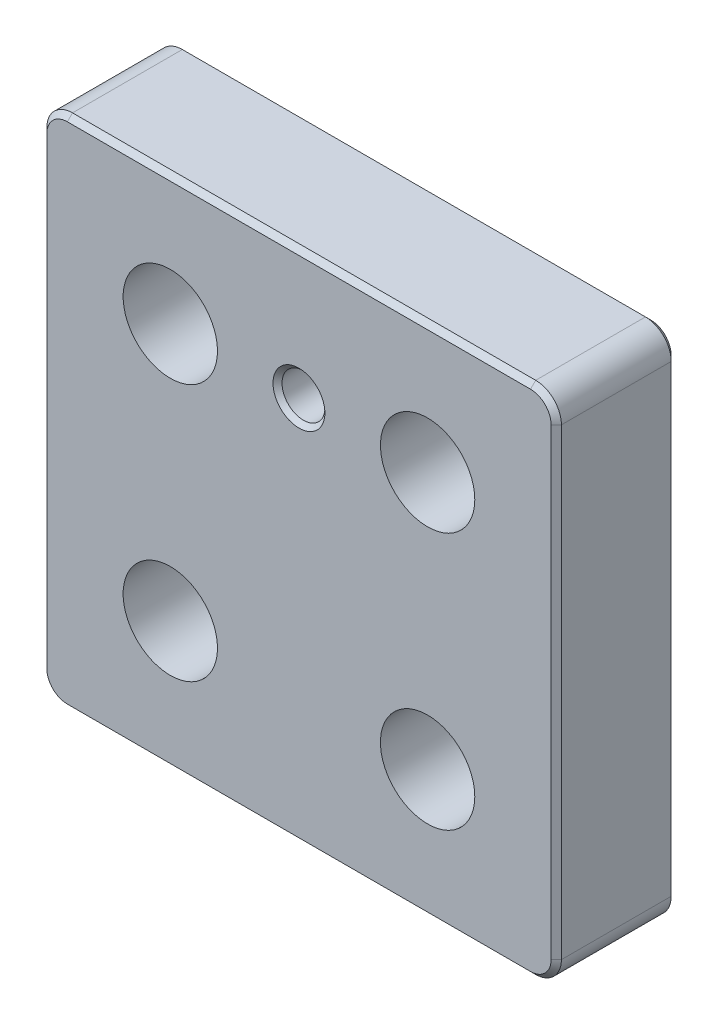
ISO-10303-21;
HEADER;
FILE_DESCRIPTION(('STEP AP214'),'2;1');
FILE_NAME('part.step','',(''),(''),'','','');
FILE_SCHEMA(('AUTOMOTIVE_DESIGN { 1 0 10303 214 1 1 1 1 }'));
ENDSEC;
DATA;
#1=APPLICATION_CONTEXT('core data for automotive mechanical design processes');
#2=APPLICATION_PROTOCOL_DEFINITION('international standard','automotive_design',2000,#1);
#3=PRODUCT_CONTEXT('',#1,'mechanical');
#4=PRODUCT('Part','Part','',(#3));
#5=PRODUCT_RELATED_PRODUCT_CATEGORY('part','',(#4));
#6=PRODUCT_DEFINITION_FORMATION('','',#4);
#7=PRODUCT_DEFINITION_CONTEXT('part definition',#1,'design');
#8=PRODUCT_DEFINITION('design','',#6,#7);
#9=PRODUCT_DEFINITION_SHAPE('','',#8);
#10=(LENGTH_UNIT() NAMED_UNIT(*) SI_UNIT(.MILLI.,.METRE.));
#11=(NAMED_UNIT(*) PLANE_ANGLE_UNIT() SI_UNIT($,.RADIAN.));
#12=(NAMED_UNIT(*) SI_UNIT($,.STERADIAN.) SOLID_ANGLE_UNIT());
#13=UNCERTAINTY_MEASURE_WITH_UNIT(LENGTH_MEASURE(1.E-05),#10,'distance_accuracy_value','');
#14=(GEOMETRIC_REPRESENTATION_CONTEXT(3) GLOBAL_UNCERTAINTY_ASSIGNED_CONTEXT((#13)) GLOBAL_UNIT_ASSIGNED_CONTEXT((#10,
#11,#12)) REPRESENTATION_CONTEXT('',''));
#15=CARTESIAN_POINT('',(0.,0.,0.));
#16=DIRECTION('',(0.,0.,1.));
#17=DIRECTION('',(1.,0.,0.));
#18=AXIS2_PLACEMENT_3D('',#15,#16,#17);
#19=CARTESIAN_POINT('',(-30.,-30.,14.));
#20=DIRECTION('',(1.,0.,0.));
#21=DIRECTION('',(0.,0.,-1.));
#22=AXIS2_PLACEMENT_3D('',#19,#20,#21);
#23=PLANE('',#22);
#24=DIRECTION('',(0.,0.,-1.));
#25=VECTOR('',#24,1.);
#26=CARTESIAN_POINT('',(-30.,27.,14.));
#27=LINE('',#26,#25);
#28=CARTESIAN_POINT('',(-30.,27.,13.4));
#29=VERTEX_POINT('',#28);
#30=CARTESIAN_POINT('',(-30.,27.,0.599999999999996));
#31=VERTEX_POINT('',#30);
#32=EDGE_CURVE('E295',#29,#31,#27,.T.);
#33=ORIENTED_EDGE('',*,*,#32,.T.);
#34=DIRECTION('',(0.,-1.,0.));
#35=VECTOR('',#34,1.);
#36=CARTESIAN_POINT('',(-30.,-30.,0.599999999999996));
#37=LINE('',#36,#35);
#38=CARTESIAN_POINT('',(-30.,-27.,0.599999999999996));
#39=VERTEX_POINT('',#38);
#40=EDGE_CURVE('E221',#31,#39,#37,.T.);
#41=ORIENTED_EDGE('',*,*,#40,.T.);
#42=DIRECTION('',(0.,0.,-1.));
#43=VECTOR('',#42,1.);
#44=CARTESIAN_POINT('',(-30.,-27.,14.));
#45=LINE('',#44,#43);
#46=CARTESIAN_POINT('',(-30.,-27.,13.4));
#47=VERTEX_POINT('',#46);
#48=EDGE_CURVE('E289',#39,#47,#45,.F.);
#49=ORIENTED_EDGE('',*,*,#48,.T.);
#50=DIRECTION('',(0.,1.,0.));
#51=VECTOR('',#50,1.);
#52=CARTESIAN_POINT('',(-30.,27.,13.4));
#53=LINE('',#52,#51);
#54=EDGE_CURVE('E219',#47,#29,#53,.T.);
#55=ORIENTED_EDGE('',*,*,#54,.T.);
#56=EDGE_LOOP('',(#33,#41,#49,#55));
#57=FACE_BOUND('',#56,.T.);
#58=ADVANCED_FACE('F45',(#57),#23,.F.);
#59=CARTESIAN_POINT('',(30.,-30.,14.));
#60=DIRECTION('',(0.,1.,0.));
#61=DIRECTION('',(-1.,0.,0.));
#62=AXIS2_PLACEMENT_3D('',#59,#60,#61);
#63=PLANE('',#62);
#64=DIRECTION('',(0.,0.,-1.));
#65=VECTOR('',#64,1.);
#66=CARTESIAN_POINT('',(-27.,-30.,14.));
#67=LINE('',#66,#65);
#68=CARTESIAN_POINT('',(-27.,-30.,13.4));
#69=VERTEX_POINT('',#68);
#70=CARTESIAN_POINT('',(-27.,-30.,0.599999999999996));
#71=VERTEX_POINT('',#70);
#72=EDGE_CURVE('E291',#69,#71,#67,.T.);
#73=ORIENTED_EDGE('',*,*,#72,.T.);
#74=DIRECTION('',(1.,0.,0.));
#75=VECTOR('',#74,1.);
#76=CARTESIAN_POINT('',(30.,-30.,0.599999999999996));
#77=LINE('',#76,#75);
#78=CARTESIAN_POINT('',(27.,-30.,0.599999999999996));
#79=VERTEX_POINT('',#78);
#80=EDGE_CURVE('E196',#71,#79,#77,.T.);
#81=ORIENTED_EDGE('',*,*,#80,.T.);
#82=DIRECTION('',(0.,0.,-1.));
#83=VECTOR('',#82,1.);
#84=CARTESIAN_POINT('',(27.,-30.,14.));
#85=LINE('',#84,#83);
#86=CARTESIAN_POINT('',(27.,-30.,13.4));
#87=VERTEX_POINT('',#86);
#88=EDGE_CURVE('E179',#79,#87,#85,.F.);
#89=ORIENTED_EDGE('',*,*,#88,.T.);
#90=DIRECTION('',(-1.,0.,0.));
#91=VECTOR('',#90,1.);
#92=CARTESIAN_POINT('',(-27.,-30.,13.4));
#93=LINE('',#92,#91);
#94=EDGE_CURVE('E194',#87,#69,#93,.T.);
#95=ORIENTED_EDGE('',*,*,#94,.T.);
#96=EDGE_LOOP('',(#73,#81,#89,#95));
#97=FACE_BOUND('',#96,.T.);
#98=ADVANCED_FACE('F337',(#97),#63,.F.);
#99=CARTESIAN_POINT('',(30.,-30.,14.));
#100=DIRECTION('',(-1.,0.,0.));
#101=DIRECTION('',(0.,0.,1.));
#102=AXIS2_PLACEMENT_3D('',#99,#100,#101);
#103=PLANE('',#102);
#104=DIRECTION('',(0.,0.,-1.));
#105=VECTOR('',#104,1.);
#106=CARTESIAN_POINT('',(30.,-27.,14.));
#107=LINE('',#106,#105);
#108=CARTESIAN_POINT('',(30.,-27.,13.4));
#109=VERTEX_POINT('',#108);
#110=CARTESIAN_POINT('',(30.,-27.,0.599999999999996));
#111=VERTEX_POINT('',#110);
#112=EDGE_CURVE('E310',#109,#111,#107,.T.);
#113=ORIENTED_EDGE('',*,*,#112,.T.);
#114=DIRECTION('',(0.,1.,0.));
#115=VECTOR('',#114,1.);
#116=CARTESIAN_POINT('',(30.,-30.,0.599999999999996));
#117=LINE('',#116,#115);
#118=CARTESIAN_POINT('',(30.,27.,0.599999999999996));
#119=VERTEX_POINT('',#118);
#120=EDGE_CURVE('E204',#111,#119,#117,.T.);
#121=ORIENTED_EDGE('',*,*,#120,.T.);
#122=DIRECTION('',(0.,0.,-1.));
#123=VECTOR('',#122,1.);
#124=CARTESIAN_POINT('',(30.,27.,14.));
#125=LINE('',#124,#123);
#126=CARTESIAN_POINT('',(30.,27.,13.4));
#127=VERTEX_POINT('',#126);
#128=EDGE_CURVE('E313',#119,#127,#125,.F.);
#129=ORIENTED_EDGE('',*,*,#128,.T.);
#130=DIRECTION('',(0.,-1.,0.));
#131=VECTOR('',#130,1.);
#132=CARTESIAN_POINT('',(30.,-27.,13.4));
#133=LINE('',#132,#131);
#134=EDGE_CURVE('E202',#127,#109,#133,.T.);
#135=ORIENTED_EDGE('',*,*,#134,.T.);
#136=EDGE_LOOP('',(#113,#121,#129,#135));
#137=FACE_BOUND('',#136,.T.);
#138=ADVANCED_FACE('F382',(#137),#103,.F.);
#139=CARTESIAN_POINT('',(30.,30.,14.));
#140=DIRECTION('',(0.,-1.,0.));
#141=DIRECTION('',(1.,0.,0.));
#142=AXIS2_PLACEMENT_3D('',#139,#140,#141);
#143=PLANE('',#142);
#144=DIRECTION('',(0.,0.,-1.));
#145=VECTOR('',#144,1.);
#146=CARTESIAN_POINT('',(27.,30.,14.));
#147=LINE('',#146,#145);
#148=CARTESIAN_POINT('',(27.,30.,13.4));
#149=VERTEX_POINT('',#148);
#150=CARTESIAN_POINT('',(27.,30.,0.599999999999996));
#151=VERTEX_POINT('',#150);
#152=EDGE_CURVE('E298',#149,#151,#147,.T.);
#153=ORIENTED_EDGE('',*,*,#152,.T.);
#154=DIRECTION('',(-1.,0.,0.));
#155=VECTOR('',#154,1.);
#156=CARTESIAN_POINT('',(30.,30.,0.599999999999996));
#157=LINE('',#156,#155);
#158=CARTESIAN_POINT('',(-27.,30.,0.599999999999996));
#159=VERTEX_POINT('',#158);
#160=EDGE_CURVE('E213',#151,#159,#157,.T.);
#161=ORIENTED_EDGE('',*,*,#160,.T.);
#162=DIRECTION('',(0.,0.,-1.));
#163=VECTOR('',#162,1.);
#164=CARTESIAN_POINT('',(-27.,30.,14.));
#165=LINE('',#164,#163);
#166=CARTESIAN_POINT('',(-27.,30.,13.4));
#167=VERTEX_POINT('',#166);
#168=EDGE_CURVE('E307',#159,#167,#165,.F.);
#169=ORIENTED_EDGE('',*,*,#168,.T.);
#170=DIRECTION('',(1.,0.,0.));
#171=VECTOR('',#170,1.);
#172=CARTESIAN_POINT('',(27.,30.,13.4));
#173=LINE('',#172,#171);
#174=EDGE_CURVE('E211',#167,#149,#173,.T.);
#175=ORIENTED_EDGE('',*,*,#174,.T.);
#176=EDGE_LOOP('',(#153,#161,#169,#175));
#177=FACE_BOUND('',#176,.T.);
#178=ADVANCED_FACE('F366',(#177),#143,.F.);
#179=CARTESIAN_POINT('',(0.,0.,14.));
#180=DIRECTION('',(0.,0.,1.));
#181=DIRECTION('',(1.,0.,0.));
#182=AXIS2_PLACEMENT_3D('',#179,#180,#181);
#183=PLANE('',#182);
#184=DIRECTION('',(0.,1.,0.));
#185=VECTOR('',#184,1.);
#186=CARTESIAN_POINT('',(29.4,27.,14.));
#187=LINE('',#186,#185);
#188=CARTESIAN_POINT('',(29.4,-27.,14.));
#189=VERTEX_POINT('',#188);
#190=CARTESIAN_POINT('',(29.4,27.,14.));
#191=VERTEX_POINT('',#190);
#192=EDGE_CURVE('E55',#189,#191,#187,.T.);
#193=ORIENTED_EDGE('',*,*,#192,.T.);
#194=CARTESIAN_POINT('',(27.,27.,14.));
#195=DIRECTION('',(0.,0.,1.));
#196=DIRECTION('',(1.,0.,0.));
#197=AXIS2_PLACEMENT_3D('',#194,#195,#196);
#198=CIRCLE('',#197,2.40000000000001);
#199=CARTESIAN_POINT('',(27.,29.4,14.));
#200=VERTEX_POINT('',#199);
#201=EDGE_CURVE('E11',#191,#200,#198,.T.);
#202=ORIENTED_EDGE('',*,*,#201,.T.);
#203=DIRECTION('',(-1.,0.,0.));
#204=VECTOR('',#203,1.);
#205=CARTESIAN_POINT('',(-27.,29.4,14.));
#206=LINE('',#205,#204);
#207=CARTESIAN_POINT('',(-27.,29.4,14.));
#208=VERTEX_POINT('',#207);
#209=EDGE_CURVE('E223',#200,#208,#206,.T.);
#210=ORIENTED_EDGE('',*,*,#209,.T.);
#211=CARTESIAN_POINT('',(-27.,27.,14.));
#212=DIRECTION('',(0.,0.,1.));
#213=DIRECTION('',(1.,0.,0.));
#214=AXIS2_PLACEMENT_3D('',#211,#212,#213);
#215=CIRCLE('',#214,2.40000000000001);
#216=CARTESIAN_POINT('',(-29.4,27.,14.));
#217=VERTEX_POINT('',#216);
#218=EDGE_CURVE('E225',#208,#217,#215,.T.);
#219=ORIENTED_EDGE('',*,*,#218,.T.);
#220=DIRECTION('',(0.,-1.,0.));
#221=VECTOR('',#220,1.);
#222=CARTESIAN_POINT('',(-29.4,-27.,14.));
#223=LINE('',#222,#221);
#224=CARTESIAN_POINT('',(-29.4,-27.,14.));
#225=VERTEX_POINT('',#224);
#226=EDGE_CURVE('E227',#217,#225,#223,.T.);
#227=ORIENTED_EDGE('',*,*,#226,.T.);
#228=CARTESIAN_POINT('',(-27.,-27.,14.));
#229=DIRECTION('',(0.,0.,1.));
#230=DIRECTION('',(1.,0.,0.));
#231=AXIS2_PLACEMENT_3D('',#228,#229,#230);
#232=CIRCLE('',#231,2.40000000000001);
#233=CARTESIAN_POINT('',(-27.,-29.4,14.));
#234=VERTEX_POINT('',#233);
#235=EDGE_CURVE('E229',#225,#234,#232,.T.);
#236=ORIENTED_EDGE('',*,*,#235,.T.);
#237=DIRECTION('',(1.,0.,0.));
#238=VECTOR('',#237,1.);
#239=CARTESIAN_POINT('',(27.,-29.4,14.));
#240=LINE('',#239,#238);
#241=CARTESIAN_POINT('',(27.,-29.4,14.));
#242=VERTEX_POINT('',#241);
#243=EDGE_CURVE('E231',#234,#242,#240,.T.);
#244=ORIENTED_EDGE('',*,*,#243,.T.);
#245=CARTESIAN_POINT('',(27.,-27.,14.));
#246=DIRECTION('',(0.,0.,1.));
#247=DIRECTION('',(1.,0.,0.));
#248=AXIS2_PLACEMENT_3D('',#245,#246,#247);
#249=CIRCLE('',#248,2.40000000000001);
#250=EDGE_CURVE('E66',#242,#189,#249,.T.);
#251=ORIENTED_EDGE('',*,*,#250,.T.);
#252=EDGE_LOOP('',(#193,#202,#210,#219,#227,#236,#244,#251));
#253=FACE_BOUND('',#252,.T.);
#254=CARTESIAN_POINT('',(0.,15.,14.));
#255=DIRECTION('',(0.,0.,1.));
#256=DIRECTION('',(1.,0.,0.));
#257=AXIS2_PLACEMENT_3D('',#254,#255,#256);
#258=CIRCLE('',#257,3.025);
#259=CARTESIAN_POINT('',(3.025,15.,14.));
#260=VERTEX_POINT('',#259);
#261=EDGE_CURVE('E252',#260,#260,#258,.T.);
#262=ORIENTED_EDGE('',*,*,#261,.F.);
#263=EDGE_LOOP('',(#262));
#264=FACE_BOUND('',#263,.T.);
#265=CARTESIAN_POINT('',(-15.,15.,14.));
#266=DIRECTION('',(0.,0.,1.));
#267=DIRECTION('',(1.,0.,0.));
#268=AXIS2_PLACEMENT_3D('',#265,#266,#267);
#269=CIRCLE('',#268,5.49999999999999);
#270=CARTESIAN_POINT('',(-9.50000000000001,15.,14.));
#271=VERTEX_POINT('',#270);
#272=EDGE_CURVE('E913',#271,#271,#269,.T.);
#273=ORIENTED_EDGE('',*,*,#272,.F.);
#274=EDGE_LOOP('',(#273));
#275=FACE_BOUND('',#274,.T.);
#276=CARTESIAN_POINT('',(15.,15.,14.));
#277=DIRECTION('',(0.,0.,1.));
#278=DIRECTION('',(1.,0.,0.));
#279=AXIS2_PLACEMENT_3D('',#276,#277,#278);
#280=CIRCLE('',#279,5.49999999999999);
#281=CARTESIAN_POINT('',(20.5,15.,14.));
#282=VERTEX_POINT('',#281);
#283=EDGE_CURVE('E901',#282,#282,#280,.T.);
#284=ORIENTED_EDGE('',*,*,#283,.F.);
#285=EDGE_LOOP('',(#284));
#286=FACE_BOUND('',#285,.T.);
#287=CARTESIAN_POINT('',(15.,-15.,14.));
#288=DIRECTION('',(0.,0.,1.));
#289=DIRECTION('',(1.,0.,0.));
#290=AXIS2_PLACEMENT_3D('',#287,#288,#289);
#291=CIRCLE('',#290,5.49999999999999);
#292=CARTESIAN_POINT('',(20.5,-15.,14.));
#293=VERTEX_POINT('',#292);
#294=EDGE_CURVE('E889',#293,#293,#291,.T.);
#295=ORIENTED_EDGE('',*,*,#294,.F.);
#296=EDGE_LOOP('',(#295));
#297=FACE_BOUND('',#296,.T.);
#298=CARTESIAN_POINT('',(-15.,-15.,14.));
#299=DIRECTION('',(0.,0.,1.));
#300=DIRECTION('',(1.,0.,0.));
#301=AXIS2_PLACEMENT_3D('',#298,#299,#300);
#302=CIRCLE('',#301,5.49999999999999);
#303=CARTESIAN_POINT('',(-9.5,-15.,14.));
#304=VERTEX_POINT('',#303);
#305=EDGE_CURVE('E875',#304,#304,#302,.T.);
#306=ORIENTED_EDGE('',*,*,#305,.F.);
#307=EDGE_LOOP('',(#306));
#308=FACE_BOUND('',#307,.T.);
#309=ADVANCED_FACE('F353',(#253,#264,#275,#286,#297,#308),#183,.T.);
#310=CARTESIAN_POINT('',(0.,0.,0.));
#311=DIRECTION('',(0.,0.,1.));
#312=DIRECTION('',(1.,0.,0.));
#313=AXIS2_PLACEMENT_3D('',#310,#311,#312);
#314=PLANE('',#313);
#315=DIRECTION('',(-1.,0.,0.));
#316=VECTOR('',#315,1.);
#317=CARTESIAN_POINT('',(0.,-29.4,0.));
#318=LINE('',#317,#316);
#319=CARTESIAN_POINT('',(27.,-29.4,0.));
#320=VERTEX_POINT('',#319);
#321=CARTESIAN_POINT('',(-27.,-29.4,0.));
#322=VERTEX_POINT('',#321);
#323=EDGE_CURVE('E184',#320,#322,#318,.T.);
#324=ORIENTED_EDGE('',*,*,#323,.T.);
#325=CARTESIAN_POINT('',(-27.,-27.,0.));
#326=DIRECTION('',(0.,0.,1.));
#327=DIRECTION('',(1.,0.,0.));
#328=AXIS2_PLACEMENT_3D('',#325,#326,#327);
#329=CIRCLE('',#328,2.4);
#330=CARTESIAN_POINT('',(-29.4,-27.,0.));
#331=VERTEX_POINT('',#330);
#332=EDGE_CURVE('E164',#322,#331,#329,.F.);
#333=ORIENTED_EDGE('',*,*,#332,.T.);
#334=DIRECTION('',(0.,1.,0.));
#335=VECTOR('',#334,1.);
#336=CARTESIAN_POINT('',(-29.4,0.,0.));
#337=LINE('',#336,#335);
#338=CARTESIAN_POINT('',(-29.4,27.,0.));
#339=VERTEX_POINT('',#338);
#340=EDGE_CURVE('E172',#331,#339,#337,.T.);
#341=ORIENTED_EDGE('',*,*,#340,.T.);
#342=CARTESIAN_POINT('',(-27.,27.,0.));
#343=DIRECTION('',(0.,0.,1.));
#344=DIRECTION('',(1.,0.,0.));
#345=AXIS2_PLACEMENT_3D('',#342,#343,#344);
#346=CIRCLE('',#345,2.4);
#347=CARTESIAN_POINT('',(-27.,29.4,0.));
#348=VERTEX_POINT('',#347);
#349=EDGE_CURVE('E178',#339,#348,#346,.F.);
#350=ORIENTED_EDGE('',*,*,#349,.T.);
#351=DIRECTION('',(1.,0.,0.));
#352=VECTOR('',#351,1.);
#353=CARTESIAN_POINT('',(0.,29.4,0.));
#354=LINE('',#353,#352);
#355=CARTESIAN_POINT('',(27.,29.4,0.));
#356=VERTEX_POINT('',#355);
#357=EDGE_CURVE('E320',#348,#356,#354,.T.);
#358=ORIENTED_EDGE('',*,*,#357,.T.);
#359=CARTESIAN_POINT('',(27.,27.,0.));
#360=DIRECTION('',(0.,0.,1.));
#361=DIRECTION('',(1.,0.,0.));
#362=AXIS2_PLACEMENT_3D('',#359,#360,#361);
#363=CIRCLE('',#362,2.4);
#364=CARTESIAN_POINT('',(29.4,27.,0.));
#365=VERTEX_POINT('',#364);
#366=EDGE_CURVE('E322',#356,#365,#363,.F.);
#367=ORIENTED_EDGE('',*,*,#366,.T.);
#368=DIRECTION('',(0.,-1.,0.));
#369=VECTOR('',#368,1.);
#370=CARTESIAN_POINT('',(29.4,0.,0.));
#371=LINE('',#370,#369);
#372=CARTESIAN_POINT('',(29.4,-27.,0.));
#373=VERTEX_POINT('',#372);
#374=EDGE_CURVE('E324',#365,#373,#371,.T.);
#375=ORIENTED_EDGE('',*,*,#374,.T.);
#376=CARTESIAN_POINT('',(27.,-27.,0.));
#377=DIRECTION('',(0.,0.,1.));
#378=DIRECTION('',(1.,0.,0.));
#379=AXIS2_PLACEMENT_3D('',#376,#377,#378);
#380=CIRCLE('',#379,2.4);
#381=EDGE_CURVE('E189',#373,#320,#380,.F.);
#382=ORIENTED_EDGE('',*,*,#381,.T.);
#383=EDGE_LOOP('',(#324,#333,#341,#350,#358,#367,#375,#382));
#384=FACE_BOUND('',#383,.T.);
#385=CARTESIAN_POINT('',(0.,15.,0.));
#386=DIRECTION('',(0.,0.,1.));
#387=DIRECTION('',(1.,0.,0.));
#388=AXIS2_PLACEMENT_3D('',#385,#386,#387);
#389=CIRCLE('',#388,2.5);
#390=CARTESIAN_POINT('',(2.49999999999999,15.,0.));
#391=VERTEX_POINT('',#390);
#392=EDGE_CURVE('E916',#391,#391,#389,.T.);
#393=ORIENTED_EDGE('',*,*,#392,.T.);
#394=EDGE_LOOP('',(#393));
#395=FACE_BOUND('',#394,.T.);
#396=CARTESIAN_POINT('',(-15.,15.,0.));
#397=DIRECTION('',(0.,0.,1.));
#398=DIRECTION('',(1.,0.,0.));
#399=AXIS2_PLACEMENT_3D('',#396,#397,#398);
#400=CIRCLE('',#399,3.25);
#401=CARTESIAN_POINT('',(-11.75,15.,0.));
#402=VERTEX_POINT('',#401);
#403=EDGE_CURVE('E904',#402,#402,#400,.T.);
#404=ORIENTED_EDGE('',*,*,#403,.T.);
#405=EDGE_LOOP('',(#404));
#406=FACE_BOUND('',#405,.T.);
#407=CARTESIAN_POINT('',(15.,15.,0.));
#408=DIRECTION('',(0.,0.,1.));
#409=DIRECTION('',(1.,0.,0.));
#410=AXIS2_PLACEMENT_3D('',#407,#408,#409);
#411=CIRCLE('',#410,3.25);
#412=CARTESIAN_POINT('',(18.25,15.,0.));
#413=VERTEX_POINT('',#412);
#414=EDGE_CURVE('E892',#413,#413,#411,.T.);
#415=ORIENTED_EDGE('',*,*,#414,.T.);
#416=EDGE_LOOP('',(#415));
#417=FACE_BOUND('',#416,.T.);
#418=CARTESIAN_POINT('',(15.,-15.,0.));
#419=DIRECTION('',(0.,0.,1.));
#420=DIRECTION('',(1.,0.,0.));
#421=AXIS2_PLACEMENT_3D('',#418,#419,#420);
#422=CIRCLE('',#421,3.25);
#423=CARTESIAN_POINT('',(18.25,-15.,0.));
#424=VERTEX_POINT('',#423);
#425=EDGE_CURVE('E880',#424,#424,#422,.T.);
#426=ORIENTED_EDGE('',*,*,#425,.T.);
#427=EDGE_LOOP('',(#426));
#428=FACE_BOUND('',#427,.T.);
#429=CARTESIAN_POINT('',(-15.,-15.,0.));
#430=DIRECTION('',(0.,0.,1.));
#431=DIRECTION('',(1.,0.,0.));
#432=AXIS2_PLACEMENT_3D('',#429,#430,#431);
#433=CIRCLE('',#432,3.25);
#434=CARTESIAN_POINT('',(-11.75,-15.,0.));
#435=VERTEX_POINT('',#434);
#436=EDGE_CURVE('E296',#435,#435,#433,.T.);
#437=ORIENTED_EDGE('',*,*,#436,.T.);
#438=EDGE_LOOP('',(#437));
#439=FACE_BOUND('',#438,.T.);
#440=ADVANCED_FACE('F181',(#384,#395,#406,#417,#428,#439),#314,.F.);
#441=CARTESIAN_POINT('',(-15.,-15.,14.));
#442=DIRECTION('',(0.,0.,1.));
#443=DIRECTION('',(1.,0.,0.));
#444=AXIS2_PLACEMENT_3D('',#441,#442,#443);
#445=CYLINDRICAL_SURFACE('',#444,3.25);
#446=ORIENTED_EDGE('',*,*,#436,.F.);
#447=EDGE_LOOP('',(#446));
#448=FACE_BOUND('',#447,.T.);
#449=CARTESIAN_POINT('',(-15.,-15.,6.));
#450=DIRECTION('',(0.,0.,1.));
#451=DIRECTION('',(1.,0.,0.));
#452=AXIS2_PLACEMENT_3D('',#449,#450,#451);
#453=CIRCLE('',#452,3.25);
#454=CARTESIAN_POINT('',(-11.75,-15.,6.));
#455=VERTEX_POINT('',#454);
#456=EDGE_CURVE('E301',#455,#455,#453,.T.);
#457=ORIENTED_EDGE('',*,*,#456,.T.);
#458=EDGE_LOOP('',(#457));
#459=FACE_BOUND('',#458,.T.);
#460=ADVANCED_FACE('F642',(#448,#459),#445,.F.);
#461=CARTESIAN_POINT('',(-11.75,-15.,6.));
#462=DIRECTION('',(0.,0.,-1.));
#463=DIRECTION('',(-1.,0.,0.));
#464=AXIS2_PLACEMENT_3D('',#461,#462,#463);
#465=PLANE('',#464);
#466=ORIENTED_EDGE('',*,*,#456,.F.);
#467=EDGE_LOOP('',(#466));
#468=FACE_BOUND('',#467,.T.);
#469=CARTESIAN_POINT('',(-15.,-15.,6.));
#470=DIRECTION('',(0.,0.,1.));
#471=DIRECTION('',(1.,0.,0.));
#472=AXIS2_PLACEMENT_3D('',#469,#470,#471);
#473=CIRCLE('',#472,5.5);
#474=CARTESIAN_POINT('',(-9.5,-15.,6.));
#475=VERTEX_POINT('',#474);
#476=EDGE_CURVE('E873',#475,#475,#473,.T.);
#477=ORIENTED_EDGE('',*,*,#476,.T.);
#478=EDGE_LOOP('',(#477));
#479=FACE_BOUND('',#478,.T.);
#480=ADVANCED_FACE('F634',(#468,#479),#465,.F.);
#481=CARTESIAN_POINT('',(-15.,-15.,14.));
#482=DIRECTION('',(0.,0.,1.));
#483=DIRECTION('',(1.,0.,0.));
#484=AXIS2_PLACEMENT_3D('',#481,#482,#483);
#485=CYLINDRICAL_SURFACE('',#484,5.5);
#486=ORIENTED_EDGE('',*,*,#476,.F.);
#487=EDGE_LOOP('',(#486));
#488=FACE_BOUND('',#487,.T.);
#489=ORIENTED_EDGE('',*,*,#305,.T.);
#490=EDGE_LOOP('',(#489));
#491=FACE_BOUND('',#490,.T.);
#492=ADVANCED_FACE('F626',(#488,#491),#485,.F.);
#493=CARTESIAN_POINT('',(15.,-15.,14.));
#494=DIRECTION('',(0.,0.,1.));
#495=DIRECTION('',(1.,0.,0.));
#496=AXIS2_PLACEMENT_3D('',#493,#494,#495);
#497=CYLINDRICAL_SURFACE('',#496,3.25);
#498=ORIENTED_EDGE('',*,*,#425,.F.);
#499=EDGE_LOOP('',(#498));
#500=FACE_BOUND('',#499,.T.);
#501=CARTESIAN_POINT('',(15.,-15.,6.));
#502=DIRECTION('',(0.,0.,1.));
#503=DIRECTION('',(1.,0.,0.));
#504=AXIS2_PLACEMENT_3D('',#501,#502,#503);
#505=CIRCLE('',#504,3.25);
#506=CARTESIAN_POINT('',(18.25,-15.,6.));
#507=VERTEX_POINT('',#506);
#508=EDGE_CURVE('E883',#507,#507,#505,.T.);
#509=ORIENTED_EDGE('',*,*,#508,.T.);
#510=EDGE_LOOP('',(#509));
#511=FACE_BOUND('',#510,.T.);
#512=ADVANCED_FACE('F618',(#500,#511),#497,.F.);
#513=CARTESIAN_POINT('',(18.25,-15.,6.));
#514=DIRECTION('',(0.,0.,-1.));
#515=DIRECTION('',(-1.,0.,0.));
#516=AXIS2_PLACEMENT_3D('',#513,#514,#515);
#517=PLANE('',#516);
#518=ORIENTED_EDGE('',*,*,#508,.F.);
#519=EDGE_LOOP('',(#518));
#520=FACE_BOUND('',#519,.T.);
#521=CARTESIAN_POINT('',(15.,-15.,6.));
#522=DIRECTION('',(0.,0.,1.));
#523=DIRECTION('',(1.,0.,0.));
#524=AXIS2_PLACEMENT_3D('',#521,#522,#523);
#525=CIRCLE('',#524,5.5);
#526=CARTESIAN_POINT('',(20.5,-15.,6.));
#527=VERTEX_POINT('',#526);
#528=EDGE_CURVE('E886',#527,#527,#525,.T.);
#529=ORIENTED_EDGE('',*,*,#528,.T.);
#530=EDGE_LOOP('',(#529));
#531=FACE_BOUND('',#530,.T.);
#532=ADVANCED_FACE('F610',(#520,#531),#517,.F.);
#533=CARTESIAN_POINT('',(15.,-15.,14.));
#534=DIRECTION('',(0.,0.,1.));
#535=DIRECTION('',(1.,0.,0.));
#536=AXIS2_PLACEMENT_3D('',#533,#534,#535);
#537=CYLINDRICAL_SURFACE('',#536,5.5);
#538=ORIENTED_EDGE('',*,*,#528,.F.);
#539=EDGE_LOOP('',(#538));
#540=FACE_BOUND('',#539,.T.);
#541=ORIENTED_EDGE('',*,*,#294,.T.);
#542=EDGE_LOOP('',(#541));
#543=FACE_BOUND('',#542,.T.);
#544=ADVANCED_FACE('F602',(#540,#543),#537,.F.);
#545=CARTESIAN_POINT('',(15.,15.,14.));
#546=DIRECTION('',(0.,0.,1.));
#547=DIRECTION('',(1.,0.,0.));
#548=AXIS2_PLACEMENT_3D('',#545,#546,#547);
#549=CYLINDRICAL_SURFACE('',#548,3.25);
#550=ORIENTED_EDGE('',*,*,#414,.F.);
#551=EDGE_LOOP('',(#550));
#552=FACE_BOUND('',#551,.T.);
#553=CARTESIAN_POINT('',(15.,15.,6.));
#554=DIRECTION('',(0.,0.,1.));
#555=DIRECTION('',(1.,0.,0.));
#556=AXIS2_PLACEMENT_3D('',#553,#554,#555);
#557=CIRCLE('',#556,3.25);
#558=CARTESIAN_POINT('',(18.25,15.,6.));
#559=VERTEX_POINT('',#558);
#560=EDGE_CURVE('E895',#559,#559,#557,.T.);
#561=ORIENTED_EDGE('',*,*,#560,.T.);
#562=EDGE_LOOP('',(#561));
#563=FACE_BOUND('',#562,.T.);
#564=ADVANCED_FACE('F594',(#552,#563),#549,.F.);
#565=CARTESIAN_POINT('',(18.25,15.,6.));
#566=DIRECTION('',(0.,0.,-1.));
#567=DIRECTION('',(-1.,0.,0.));
#568=AXIS2_PLACEMENT_3D('',#565,#566,#567);
#569=PLANE('',#568);
#570=ORIENTED_EDGE('',*,*,#560,.F.);
#571=EDGE_LOOP('',(#570));
#572=FACE_BOUND('',#571,.T.);
#573=CARTESIAN_POINT('',(15.,15.,6.));
#574=DIRECTION('',(0.,0.,1.));
#575=DIRECTION('',(1.,0.,0.));
#576=AXIS2_PLACEMENT_3D('',#573,#574,#575);
#577=CIRCLE('',#576,5.5);
#578=CARTESIAN_POINT('',(20.5,15.,6.));
#579=VERTEX_POINT('',#578);
#580=EDGE_CURVE('E898',#579,#579,#577,.T.);
#581=ORIENTED_EDGE('',*,*,#580,.T.);
#582=EDGE_LOOP('',(#581));
#583=FACE_BOUND('',#582,.T.);
#584=ADVANCED_FACE('F586',(#572,#583),#569,.F.);
#585=CARTESIAN_POINT('',(15.,15.,14.));
#586=DIRECTION('',(0.,0.,1.));
#587=DIRECTION('',(1.,0.,0.));
#588=AXIS2_PLACEMENT_3D('',#585,#586,#587);
#589=CYLINDRICAL_SURFACE('',#588,5.5);
#590=ORIENTED_EDGE('',*,*,#580,.F.);
#591=EDGE_LOOP('',(#590));
#592=FACE_BOUND('',#591,.T.);
#593=ORIENTED_EDGE('',*,*,#283,.T.);
#594=EDGE_LOOP('',(#593));
#595=FACE_BOUND('',#594,.T.);
#596=ADVANCED_FACE('F578',(#592,#595),#589,.F.);
#597=CARTESIAN_POINT('',(-15.,15.,14.));
#598=DIRECTION('',(0.,0.,1.));
#599=DIRECTION('',(1.,0.,0.));
#600=AXIS2_PLACEMENT_3D('',#597,#598,#599);
#601=CYLINDRICAL_SURFACE('',#600,3.25);
#602=ORIENTED_EDGE('',*,*,#403,.F.);
#603=EDGE_LOOP('',(#602));
#604=FACE_BOUND('',#603,.T.);
#605=CARTESIAN_POINT('',(-15.,15.,6.));
#606=DIRECTION('',(0.,0.,1.));
#607=DIRECTION('',(1.,0.,0.));
#608=AXIS2_PLACEMENT_3D('',#605,#606,#607);
#609=CIRCLE('',#608,3.25);
#610=CARTESIAN_POINT('',(-11.75,15.,6.));
#611=VERTEX_POINT('',#610);
#612=EDGE_CURVE('E907',#611,#611,#609,.T.);
#613=ORIENTED_EDGE('',*,*,#612,.T.);
#614=EDGE_LOOP('',(#613));
#615=FACE_BOUND('',#614,.T.);
#616=ADVANCED_FACE('F570',(#604,#615),#601,.F.);
#617=CARTESIAN_POINT('',(-11.75,15.,6.));
#618=DIRECTION('',(0.,0.,-1.));
#619=DIRECTION('',(-1.,0.,0.));
#620=AXIS2_PLACEMENT_3D('',#617,#618,#619);
#621=PLANE('',#620);
#622=ORIENTED_EDGE('',*,*,#612,.F.);
#623=EDGE_LOOP('',(#622));
#624=FACE_BOUND('',#623,.T.);
#625=CARTESIAN_POINT('',(-15.,15.,6.));
#626=DIRECTION('',(0.,0.,1.));
#627=DIRECTION('',(1.,0.,0.));
#628=AXIS2_PLACEMENT_3D('',#625,#626,#627);
#629=CIRCLE('',#628,5.5);
#630=CARTESIAN_POINT('',(-9.50000000000001,15.,6.));
#631=VERTEX_POINT('',#630);
#632=EDGE_CURVE('E910',#631,#631,#629,.T.);
#633=ORIENTED_EDGE('',*,*,#632,.T.);
#634=EDGE_LOOP('',(#633));
#635=FACE_BOUND('',#634,.T.);
#636=ADVANCED_FACE('F561',(#624,#635),#621,.F.);
#637=CARTESIAN_POINT('',(-15.,15.,14.));
#638=DIRECTION('',(0.,0.,1.));
#639=DIRECTION('',(1.,0.,0.));
#640=AXIS2_PLACEMENT_3D('',#637,#638,#639);
#641=CYLINDRICAL_SURFACE('',#640,5.5);
#642=ORIENTED_EDGE('',*,*,#632,.F.);
#643=EDGE_LOOP('',(#642));
#644=FACE_BOUND('',#643,.T.);
#645=ORIENTED_EDGE('',*,*,#272,.T.);
#646=EDGE_LOOP('',(#645));
#647=FACE_BOUND('',#646,.T.);
#648=ADVANCED_FACE('F554',(#644,#647),#641,.F.);
#649=CARTESIAN_POINT('',(0.,15.,14.));
#650=DIRECTION('',(0.,0.,1.));
#651=DIRECTION('',(1.,0.,0.));
#652=AXIS2_PLACEMENT_3D('',#649,#650,#651);
#653=CYLINDRICAL_SURFACE('',#652,2.5);
#654=ORIENTED_EDGE('',*,*,#392,.F.);
#655=EDGE_LOOP('',(#654));
#656=FACE_BOUND('',#655,.T.);
#657=CARTESIAN_POINT('',(0.,15.,13.475));
#658=DIRECTION('',(0.,0.,1.));
#659=DIRECTION('',(1.,0.,0.));
#660=AXIS2_PLACEMENT_3D('',#657,#658,#659);
#661=CIRCLE('',#660,2.5);
#662=CARTESIAN_POINT('',(2.5,15.,13.475));
#663=VERTEX_POINT('',#662);
#664=EDGE_CURVE('E919',#663,#663,#661,.T.);
#665=ORIENTED_EDGE('',*,*,#664,.T.);
#666=EDGE_LOOP('',(#665));
#667=FACE_BOUND('',#666,.T.);
#668=ADVANCED_FACE('F545',(#656,#667),#653,.F.);
#669=CARTESIAN_POINT('',(0.,15.,14.));
#670=DIRECTION('',(0.,0.,1.));
#671=DIRECTION('',(1.,0.,0.));
#672=AXIS2_PLACEMENT_3D('',#669,#670,#671);
#673=CONICAL_SURFACE('',#672,3.025,0.785398163397448);
#674=ORIENTED_EDGE('',*,*,#664,.F.);
#675=EDGE_LOOP('',(#674));
#676=FACE_BOUND('',#675,.T.);
#677=ORIENTED_EDGE('',*,*,#261,.T.);
#678=EDGE_LOOP('',(#677));
#679=FACE_BOUND('',#678,.T.);
#680=ADVANCED_FACE('F399',(#676,#679),#673,.F.);
#681=CARTESIAN_POINT('',(-27.,27.,14.));
#682=DIRECTION('',(0.,0.,-1.));
#683=DIRECTION('',(-1.,0.,0.));
#684=AXIS2_PLACEMENT_3D('',#681,#682,#683);
#685=CYLINDRICAL_SURFACE('',#684,3.);
#686=ORIENTED_EDGE('',*,*,#168,.F.);
#687=CARTESIAN_POINT('',(-27.,27.,0.599999999999996));
#688=DIRECTION('',(0.,0.,1.));
#689=DIRECTION('',(1.,0.,0.));
#690=AXIS2_PLACEMENT_3D('',#687,#688,#689);
#691=CIRCLE('',#690,3.);
#692=EDGE_CURVE('E217',#159,#31,#691,.T.);
#693=ORIENTED_EDGE('',*,*,#692,.T.);
#694=ORIENTED_EDGE('',*,*,#32,.F.);
#695=CARTESIAN_POINT('',(-27.,27.,13.4));
#696=DIRECTION('',(0.,0.,1.));
#697=DIRECTION('',(1.,0.,0.));
#698=AXIS2_PLACEMENT_3D('',#695,#696,#697);
#699=CIRCLE('',#698,3.);
#700=EDGE_CURVE('E215',#29,#167,#699,.F.);
#701=ORIENTED_EDGE('',*,*,#700,.T.);
#702=EDGE_LOOP('',(#686,#693,#694,#701));
#703=FACE_BOUND('',#702,.T.);
#704=ADVANCED_FACE('F396',(#703),#685,.T.);
#705=CARTESIAN_POINT('',(27.,27.,14.));
#706=DIRECTION('',(0.,0.,-1.));
#707=DIRECTION('',(-1.,0.,0.));
#708=AXIS2_PLACEMENT_3D('',#705,#706,#707);
#709=CYLINDRICAL_SURFACE('',#708,3.);
#710=ORIENTED_EDGE('',*,*,#128,.F.);
#711=CARTESIAN_POINT('',(27.,27.,0.599999999999996));
#712=DIRECTION('',(0.,0.,1.));
#713=DIRECTION('',(1.,0.,0.));
#714=AXIS2_PLACEMENT_3D('',#711,#712,#713);
#715=CIRCLE('',#714,3.);
#716=EDGE_CURVE('E209',#119,#151,#715,.T.);
#717=ORIENTED_EDGE('',*,*,#716,.T.);
#718=ORIENTED_EDGE('',*,*,#152,.F.);
#719=CARTESIAN_POINT('',(27.,27.,13.4));
#720=DIRECTION('',(0.,0.,1.));
#721=DIRECTION('',(1.,0.,0.));
#722=AXIS2_PLACEMENT_3D('',#719,#720,#721);
#723=CIRCLE('',#722,3.);
#724=EDGE_CURVE('E206',#149,#127,#723,.F.);
#725=ORIENTED_EDGE('',*,*,#724,.T.);
#726=EDGE_LOOP('',(#710,#717,#718,#725));
#727=FACE_BOUND('',#726,.T.);
#728=ADVANCED_FACE('F371',(#727),#709,.T.);
#729=CARTESIAN_POINT('',(27.,-27.,14.));
#730=DIRECTION('',(0.,0.,-1.));
#731=DIRECTION('',(-1.,0.,0.));
#732=AXIS2_PLACEMENT_3D('',#729,#730,#731);
#733=CYLINDRICAL_SURFACE('',#732,3.);
#734=ORIENTED_EDGE('',*,*,#88,.F.);
#735=CARTESIAN_POINT('',(27.,-27.,0.599999999999996));
#736=DIRECTION('',(0.,0.,1.));
#737=DIRECTION('',(1.,0.,0.));
#738=AXIS2_PLACEMENT_3D('',#735,#736,#737);
#739=CIRCLE('',#738,3.);
#740=EDGE_CURVE('E200',#79,#111,#739,.T.);
#741=ORIENTED_EDGE('',*,*,#740,.T.);
#742=ORIENTED_EDGE('',*,*,#112,.F.);
#743=CARTESIAN_POINT('',(27.,-27.,13.4));
#744=DIRECTION('',(0.,0.,1.));
#745=DIRECTION('',(1.,0.,0.));
#746=AXIS2_PLACEMENT_3D('',#743,#744,#745);
#747=CIRCLE('',#746,3.);
#748=EDGE_CURVE('E198',#109,#87,#747,.F.);
#749=ORIENTED_EDGE('',*,*,#748,.T.);
#750=EDGE_LOOP('',(#734,#741,#742,#749));
#751=FACE_BOUND('',#750,.T.);
#752=ADVANCED_FACE('F339',(#751),#733,.T.);
#753=CARTESIAN_POINT('',(-27.,-27.,14.));
#754=DIRECTION('',(0.,0.,-1.));
#755=DIRECTION('',(-1.,0.,0.));
#756=AXIS2_PLACEMENT_3D('',#753,#754,#755);
#757=CYLINDRICAL_SURFACE('',#756,3.);
#758=ORIENTED_EDGE('',*,*,#48,.F.);
#759=CARTESIAN_POINT('',(-27.,-27.,0.599999999999996));
#760=DIRECTION('',(0.,0.,1.));
#761=DIRECTION('',(1.,0.,0.));
#762=AXIS2_PLACEMENT_3D('',#759,#760,#761);
#763=CIRCLE('',#762,3.);
#764=EDGE_CURVE('E166',#39,#71,#763,.T.);
#765=ORIENTED_EDGE('',*,*,#764,.T.);
#766=ORIENTED_EDGE('',*,*,#72,.F.);
#767=CARTESIAN_POINT('',(-27.,-27.,13.4));
#768=DIRECTION('',(0.,0.,1.));
#769=DIRECTION('',(1.,0.,0.));
#770=AXIS2_PLACEMENT_3D('',#767,#768,#769);
#771=CIRCLE('',#770,3.);
#772=EDGE_CURVE('E186',#69,#47,#771,.F.);
#773=ORIENTED_EDGE('',*,*,#772,.T.);
#774=EDGE_LOOP('',(#758,#765,#766,#773));
#775=FACE_BOUND('',#774,.T.);
#776=ADVANCED_FACE('F288',(#775),#757,.T.);
#777=CARTESIAN_POINT('',(27.,27.,0.));
#778=DIRECTION('',(0.,0.,1.));
#779=DIRECTION('',(1.,0.,0.));
#780=AXIS2_PLACEMENT_3D('',#777,#778,#779);
#781=CONICAL_SURFACE('',#780,2.4,0.785398163397455);
#782=DIRECTION('',(0.,-0.707106781186552,-0.707106781186543));
#783=VECTOR('',#782,1.);
#784=CARTESIAN_POINT('',(27.,30.,0.599999999999996));
#785=LINE('',#784,#783);
#786=EDGE_CURVE('E246',#151,#356,#785,.T.);
#787=ORIENTED_EDGE('',*,*,#786,.F.);
#788=ORIENTED_EDGE('',*,*,#716,.F.);
#789=DIRECTION('',(0.707106781186552,0.,0.707106781186543));
#790=VECTOR('',#789,1.);
#791=CARTESIAN_POINT('',(29.4,27.,0.));
#792=LINE('',#791,#790);
#793=EDGE_CURVE('E249',#365,#119,#792,.T.);
#794=ORIENTED_EDGE('',*,*,#793,.F.);
#795=ORIENTED_EDGE('',*,*,#366,.F.);
#796=EDGE_LOOP('',(#787,#788,#794,#795));
#797=FACE_BOUND('',#796,.T.);
#798=ADVANCED_FACE('F375',(#797),#781,.T.);
#799=CARTESIAN_POINT('',(30.,-30.,0.599999999999996));
#800=DIRECTION('',(-0.707106781186543,0.,0.707106781186552));
#801=DIRECTION('',(0.,1.,0.));
#802=AXIS2_PLACEMENT_3D('',#799,#800,#801);
#803=PLANE('',#802);
#804=ORIENTED_EDGE('',*,*,#793,.T.);
#805=ORIENTED_EDGE('',*,*,#120,.F.);
#806=DIRECTION('',(0.707106781186552,0.,0.707106781186543));
#807=VECTOR('',#806,1.);
#808=CARTESIAN_POINT('',(29.4,-27.,0.));
#809=LINE('',#808,#807);
#810=EDGE_CURVE('E243',#373,#111,#809,.T.);
#811=ORIENTED_EDGE('',*,*,#810,.F.);
#812=ORIENTED_EDGE('',*,*,#374,.F.);
#813=EDGE_LOOP('',(#804,#805,#811,#812));
#814=FACE_BOUND('',#813,.T.);
#815=ADVANCED_FACE('F380',(#814),#803,.F.);
#816=CARTESIAN_POINT('',(30.,30.,0.599999999999996));
#817=DIRECTION('',(0.,-0.707106781186543,0.707106781186552));
#818=DIRECTION('',(-1.,0.,0.));
#819=AXIS2_PLACEMENT_3D('',#816,#817,#818);
#820=PLANE('',#819);
#821=ORIENTED_EDGE('',*,*,#786,.T.);
#822=ORIENTED_EDGE('',*,*,#357,.F.);
#823=DIRECTION('',(0.,-0.707106781186552,-0.707106781186543));
#824=VECTOR('',#823,1.);
#825=CARTESIAN_POINT('',(-27.,30.,0.599999999999996));
#826=LINE('',#825,#824);
#827=EDGE_CURVE('E240',#159,#348,#826,.T.);
#828=ORIENTED_EDGE('',*,*,#827,.F.);
#829=ORIENTED_EDGE('',*,*,#160,.F.);
#830=EDGE_LOOP('',(#821,#822,#828,#829));
#831=FACE_BOUND('',#830,.T.);
#832=ADVANCED_FACE('F435',(#831),#820,.F.);
#833=CARTESIAN_POINT('',(27.,-27.,0.));
#834=DIRECTION('',(0.,0.,1.));
#835=DIRECTION('',(1.,0.,0.));
#836=AXIS2_PLACEMENT_3D('',#833,#834,#835);
#837=CONICAL_SURFACE('',#836,2.4,0.785398163397455);
#838=ORIENTED_EDGE('',*,*,#810,.T.);
#839=ORIENTED_EDGE('',*,*,#740,.F.);
#840=DIRECTION('',(0.,-0.707106781186552,0.707106781186543));
#841=VECTOR('',#840,1.);
#842=CARTESIAN_POINT('',(27.,-29.4,0.));
#843=LINE('',#842,#841);
#844=EDGE_CURVE('E237',#320,#79,#843,.T.);
#845=ORIENTED_EDGE('',*,*,#844,.F.);
#846=ORIENTED_EDGE('',*,*,#381,.F.);
#847=EDGE_LOOP('',(#838,#839,#845,#846));
#848=FACE_BOUND('',#847,.T.);
#849=ADVANCED_FACE('F331',(#848),#837,.T.);
#850=CARTESIAN_POINT('',(-27.,27.,0.));
#851=DIRECTION('',(0.,0.,1.));
#852=DIRECTION('',(1.,0.,0.));
#853=AXIS2_PLACEMENT_3D('',#850,#851,#852);
#854=CONICAL_SURFACE('',#853,2.4,0.785398163397455);
#855=ORIENTED_EDGE('',*,*,#827,.T.);
#856=ORIENTED_EDGE('',*,*,#349,.F.);
#857=DIRECTION('',(0.707106781186552,0.,-0.707106781186543));
#858=VECTOR('',#857,1.);
#859=CARTESIAN_POINT('',(-30.,27.,0.599999999999996));
#860=LINE('',#859,#858);
#861=EDGE_CURVE('E175',#31,#339,#860,.T.);
#862=ORIENTED_EDGE('',*,*,#861,.F.);
#863=ORIENTED_EDGE('',*,*,#692,.F.);
#864=EDGE_LOOP('',(#855,#856,#862,#863));
#865=FACE_BOUND('',#864,.T.);
#866=ADVANCED_FACE('F423',(#865),#854,.T.);
#867=CARTESIAN_POINT('',(30.,-30.,0.599999999999996));
#868=DIRECTION('',(0.,0.707106781186543,0.707106781186552));
#869=DIRECTION('',(1.,0.,0.));
#870=AXIS2_PLACEMENT_3D('',#867,#868,#869);
#871=PLANE('',#870);
#872=ORIENTED_EDGE('',*,*,#844,.T.);
#873=ORIENTED_EDGE('',*,*,#80,.F.);
#874=DIRECTION('',(0.,-0.707106781186552,0.707106781186543));
#875=VECTOR('',#874,1.);
#876=CARTESIAN_POINT('',(-27.,-29.4,0.));
#877=LINE('',#876,#875);
#878=EDGE_CURVE('E169',#322,#71,#877,.T.);
#879=ORIENTED_EDGE('',*,*,#878,.F.);
#880=ORIENTED_EDGE('',*,*,#323,.F.);
#881=EDGE_LOOP('',(#872,#873,#879,#880));
#882=FACE_BOUND('',#881,.T.);
#883=ADVANCED_FACE('F334',(#882),#871,.F.);
#884=CARTESIAN_POINT('',(-30.,-30.,0.599999999999996));
#885=DIRECTION('',(0.707106781186543,0.,0.707106781186552));
#886=DIRECTION('',(0.,-1.,0.));
#887=AXIS2_PLACEMENT_3D('',#884,#885,#886);
#888=PLANE('',#887);
#889=ORIENTED_EDGE('',*,*,#861,.T.);
#890=ORIENTED_EDGE('',*,*,#340,.F.);
#891=DIRECTION('',(0.707106781186552,0.,-0.707106781186543));
#892=VECTOR('',#891,1.);
#893=CARTESIAN_POINT('',(-30.,-27.,0.599999999999996));
#894=LINE('',#893,#892);
#895=EDGE_CURVE('E160',#39,#331,#894,.T.);
#896=ORIENTED_EDGE('',*,*,#895,.F.);
#897=ORIENTED_EDGE('',*,*,#40,.F.);
#898=EDGE_LOOP('',(#889,#890,#896,#897));
#899=FACE_BOUND('',#898,.T.);
#900=ADVANCED_FACE('F173',(#899),#888,.F.);
#901=CARTESIAN_POINT('',(-27.,-27.,0.));
#902=DIRECTION('',(0.,0.,1.));
#903=DIRECTION('',(1.,0.,0.));
#904=AXIS2_PLACEMENT_3D('',#901,#902,#903);
#905=CONICAL_SURFACE('',#904,2.4,0.785398163397455);
#906=ORIENTED_EDGE('',*,*,#878,.T.);
#907=ORIENTED_EDGE('',*,*,#764,.F.);
#908=ORIENTED_EDGE('',*,*,#895,.T.);
#909=ORIENTED_EDGE('',*,*,#332,.F.);
#910=EDGE_LOOP('',(#906,#907,#908,#909));
#911=FACE_BOUND('',#910,.T.);
#912=ADVANCED_FACE('F162',(#911),#905,.T.);
#913=CARTESIAN_POINT('',(-27.,-27.,14.));
#914=DIRECTION('',(0.,0.,-1.));
#915=DIRECTION('',(-1.,0.,0.));
#916=AXIS2_PLACEMENT_3D('',#913,#914,#915);
#917=CONICAL_SURFACE('',#916,2.40000000000001,0.785398163397443);
#918=DIRECTION('',(0.707106781186543,0.,0.707106781186552));
#919=VECTOR('',#918,1.);
#920=CARTESIAN_POINT('',(-30.,-27.,13.4));
#921=LINE('',#920,#919);
#922=EDGE_CURVE('E268',#47,#225,#921,.T.);
#923=ORIENTED_EDGE('',*,*,#922,.F.);
#924=ORIENTED_EDGE('',*,*,#772,.F.);
#925=DIRECTION('',(0.,-0.707106781186543,-0.707106781186552));
#926=VECTOR('',#925,1.);
#927=CARTESIAN_POINT('',(-27.,-29.4,14.));
#928=LINE('',#927,#926);
#929=EDGE_CURVE('E50',#234,#69,#928,.T.);
#930=ORIENTED_EDGE('',*,*,#929,.F.);
#931=ORIENTED_EDGE('',*,*,#235,.F.);
#932=EDGE_LOOP('',(#923,#924,#930,#931));
#933=FACE_BOUND('',#932,.T.);
#934=ADVANCED_FACE('F48',(#933),#917,.T.);
#935=CARTESIAN_POINT('',(0.,-29.4,14.));
#936=DIRECTION('',(0.,-0.707106781186552,0.707106781186543));
#937=DIRECTION('',(-1.,0.,0.));
#938=AXIS2_PLACEMENT_3D('',#935,#936,#937);
#939=PLANE('',#938);
#940=ORIENTED_EDGE('',*,*,#929,.T.);
#941=ORIENTED_EDGE('',*,*,#94,.F.);
#942=DIRECTION('',(0.,-0.707106781186543,-0.707106781186552));
#943=VECTOR('',#942,1.);
#944=CARTESIAN_POINT('',(27.,-29.4,14.));
#945=LINE('',#944,#943);
#946=EDGE_CURVE('E266',#242,#87,#945,.T.);
#947=ORIENTED_EDGE('',*,*,#946,.F.);
#948=ORIENTED_EDGE('',*,*,#243,.F.);
#949=EDGE_LOOP('',(#940,#941,#947,#948));
#950=FACE_BOUND('',#949,.T.);
#951=ADVANCED_FACE('F279',(#950),#939,.T.);
#952=CARTESIAN_POINT('',(-29.4,0.,14.));
#953=DIRECTION('',(-0.707106781186552,0.,0.707106781186543));
#954=DIRECTION('',(0.,1.,0.));
#955=AXIS2_PLACEMENT_3D('',#952,#953,#954);
#956=PLANE('',#955);
#957=ORIENTED_EDGE('',*,*,#922,.T.);
#958=ORIENTED_EDGE('',*,*,#226,.F.);
#959=DIRECTION('',(0.707106781186543,0.,0.707106781186552));
#960=VECTOR('',#959,1.);
#961=CARTESIAN_POINT('',(-30.,27.,13.4));
#962=LINE('',#961,#960);
#963=EDGE_CURVE('E263',#29,#217,#962,.T.);
#964=ORIENTED_EDGE('',*,*,#963,.F.);
#965=ORIENTED_EDGE('',*,*,#54,.F.);
#966=EDGE_LOOP('',(#957,#958,#964,#965));
#967=FACE_BOUND('',#966,.T.);
#968=ADVANCED_FACE('F477',(#967),#956,.T.);
#969=CARTESIAN_POINT('',(27.,-27.,14.));
#970=DIRECTION('',(0.,0.,-1.));
#971=DIRECTION('',(-1.,0.,0.));
#972=AXIS2_PLACEMENT_3D('',#969,#970,#971);
#973=CONICAL_SURFACE('',#972,2.40000000000001,0.785398163397443);
#974=ORIENTED_EDGE('',*,*,#946,.T.);
#975=ORIENTED_EDGE('',*,*,#748,.F.);
#976=DIRECTION('',(0.707106781186543,0.,-0.707106781186552));
#977=VECTOR('',#976,1.);
#978=CARTESIAN_POINT('',(29.4,-27.,14.));
#979=LINE('',#978,#977);
#980=EDGE_CURVE('E260',#189,#109,#979,.T.);
#981=ORIENTED_EDGE('',*,*,#980,.F.);
#982=ORIENTED_EDGE('',*,*,#250,.F.);
#983=EDGE_LOOP('',(#974,#975,#981,#982));
#984=FACE_BOUND('',#983,.T.);
#985=ADVANCED_FACE('F343',(#984),#973,.T.);
#986=CARTESIAN_POINT('',(-27.,27.,14.));
#987=DIRECTION('',(0.,0.,-1.));
#988=DIRECTION('',(-1.,0.,0.));
#989=AXIS2_PLACEMENT_3D('',#986,#987,#988);
#990=CONICAL_SURFACE('',#989,2.40000000000001,0.785398163397443);
#991=ORIENTED_EDGE('',*,*,#963,.T.);
#992=ORIENTED_EDGE('',*,*,#218,.F.);
#993=DIRECTION('',(0.,-0.707106781186543,0.707106781186552));
#994=VECTOR('',#993,1.);
#995=CARTESIAN_POINT('',(-27.,30.,13.4));
#996=LINE('',#995,#994);
#997=EDGE_CURVE('E257',#167,#208,#996,.T.);
#998=ORIENTED_EDGE('',*,*,#997,.F.);
#999=ORIENTED_EDGE('',*,*,#700,.F.);
#1000=EDGE_LOOP('',(#991,#992,#998,#999));
#1001=FACE_BOUND('',#1000,.T.);
#1002=ADVANCED_FACE('F359',(#1001),#990,.T.);
#1003=CARTESIAN_POINT('',(29.4,0.,14.));
#1004=DIRECTION('',(0.707106781186552,0.,0.707106781186543));
#1005=DIRECTION('',(0.,-1.,0.));
#1006=AXIS2_PLACEMENT_3D('',#1003,#1004,#1005);
#1007=PLANE('',#1006);
#1008=ORIENTED_EDGE('',*,*,#980,.T.);
#1009=ORIENTED_EDGE('',*,*,#134,.F.);
#1010=DIRECTION('',(0.707106781186543,0.,-0.707106781186552));
#1011=VECTOR('',#1010,1.);
#1012=CARTESIAN_POINT('',(29.4,27.,14.));
#1013=LINE('',#1012,#1011);
#1014=EDGE_CURVE('E255',#191,#127,#1013,.T.);
#1015=ORIENTED_EDGE('',*,*,#1014,.F.);
#1016=ORIENTED_EDGE('',*,*,#192,.F.);
#1017=EDGE_LOOP('',(#1008,#1009,#1015,#1016));
#1018=FACE_BOUND('',#1017,.T.);
#1019=ADVANCED_FACE('F346',(#1018),#1007,.T.);
#1020=CARTESIAN_POINT('',(0.,29.4,14.));
#1021=DIRECTION('',(0.,0.707106781186552,0.707106781186543));
#1022=DIRECTION('',(1.,0.,0.));
#1023=AXIS2_PLACEMENT_3D('',#1020,#1021,#1022);
#1024=PLANE('',#1023);
#1025=ORIENTED_EDGE('',*,*,#997,.T.);
#1026=ORIENTED_EDGE('',*,*,#209,.F.);
#1027=DIRECTION('',(0.,-0.707106781186543,0.707106781186552));
#1028=VECTOR('',#1027,1.);
#1029=CARTESIAN_POINT('',(27.,30.,13.4));
#1030=LINE('',#1029,#1028);
#1031=EDGE_CURVE('E253',#149,#200,#1030,.T.);
#1032=ORIENTED_EDGE('',*,*,#1031,.F.);
#1033=ORIENTED_EDGE('',*,*,#174,.F.);
#1034=EDGE_LOOP('',(#1025,#1026,#1032,#1033));
#1035=FACE_BOUND('',#1034,.T.);
#1036=ADVANCED_FACE('F363',(#1035),#1024,.T.);
#1037=CARTESIAN_POINT('',(27.,27.,14.));
#1038=DIRECTION('',(0.,0.,-1.));
#1039=DIRECTION('',(-1.,0.,0.));
#1040=AXIS2_PLACEMENT_3D('',#1037,#1038,#1039);
#1041=CONICAL_SURFACE('',#1040,2.40000000000001,0.785398163397443);
#1042=ORIENTED_EDGE('',*,*,#1014,.T.);
#1043=ORIENTED_EDGE('',*,*,#724,.F.);
#1044=ORIENTED_EDGE('',*,*,#1031,.T.);
#1045=ORIENTED_EDGE('',*,*,#201,.F.);
#1046=EDGE_LOOP('',(#1042,#1043,#1044,#1045));
#1047=FACE_BOUND('',#1046,.T.);
#1048=ADVANCED_FACE('F350',(#1047),#1041,.T.);
#1049=CLOSED_SHELL('',(#58,#98,#138,#178,#309,#440,#460,#480,#492,#512,#532,#544,#564,#584,#596,
#616,#636,#648,#668,#680,#704,#728,#752,#776,#798,#815,#832,#849,#866,#883,#900,#912,#934,#951,
#968,#985,#1002,#1019,#1036,#1048));
#1050=MANIFOLD_SOLID_BREP('B2',#1049);
#1051=ADVANCED_BREP_SHAPE_REPRESENTATION('',(#18,#1050),#14);
#1052=SHAPE_DEFINITION_REPRESENTATION(#9,#1051);
ENDSEC;
END-ISO-10303-21;
